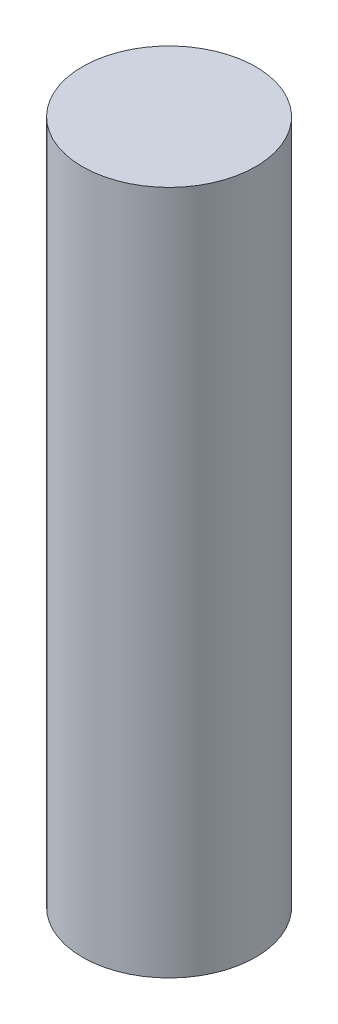
ISO-10303-21;
HEADER;
FILE_DESCRIPTION(('STEP AP214'),'2;1');
FILE_NAME('part.step','',(''),(''),'','','');
FILE_SCHEMA(('AUTOMOTIVE_DESIGN { 1 0 10303 214 1 1 1 1 }'));
ENDSEC;
DATA;
#1=APPLICATION_CONTEXT('core data for automotive mechanical design processes');
#2=APPLICATION_PROTOCOL_DEFINITION('international standard','automotive_design',2000,#1);
#3=PRODUCT_CONTEXT('',#1,'mechanical');
#4=PRODUCT('Part','Part','',(#3));
#5=PRODUCT_RELATED_PRODUCT_CATEGORY('part','',(#4));
#6=PRODUCT_DEFINITION_FORMATION('','',#4);
#7=PRODUCT_DEFINITION_CONTEXT('part definition',#1,'design');
#8=PRODUCT_DEFINITION('design','',#6,#7);
#9=PRODUCT_DEFINITION_SHAPE('','',#8);
#10=(LENGTH_UNIT() NAMED_UNIT(*) SI_UNIT(.MILLI.,.METRE.));
#11=(NAMED_UNIT(*) PLANE_ANGLE_UNIT() SI_UNIT($,.RADIAN.));
#12=(NAMED_UNIT(*) SI_UNIT($,.STERADIAN.) SOLID_ANGLE_UNIT());
#13=UNCERTAINTY_MEASURE_WITH_UNIT(LENGTH_MEASURE(1.E-05),#10,'distance_accuracy_value','');
#14=(GEOMETRIC_REPRESENTATION_CONTEXT(3) GLOBAL_UNCERTAINTY_ASSIGNED_CONTEXT((#13)) GLOBAL_UNIT_ASSIGNED_CONTEXT((#10,
#11,#12)) REPRESENTATION_CONTEXT('',''));
#15=CARTESIAN_POINT('',(0.,0.,0.));
#16=DIRECTION('',(0.,0.,1.));
#17=DIRECTION('',(1.,0.,0.));
#18=AXIS2_PLACEMENT_3D('',#15,#16,#17);
#19=CARTESIAN_POINT('',(0.,71.12,0.));
#20=DIRECTION('',(0.,-1.,0.));
#21=DIRECTION('',(0.,0.,-1.));
#22=AXIS2_PLACEMENT_3D('',#19,#20,#21);
#23=CYLINDRICAL_SURFACE('',#22,9.);
#24=CARTESIAN_POINT('',(0.,71.12,0.));
#25=DIRECTION('',(0.,1.,0.));
#26=DIRECTION('',(0.,0.,1.));
#27=AXIS2_PLACEMENT_3D('',#24,#25,#26);
#28=CIRCLE('',#27,9.);
#29=CARTESIAN_POINT('',(0.,71.12,9.));
#30=VERTEX_POINT('',#29);
#31=EDGE_CURVE('E10',#30,#30,#28,.T.);
#32=ORIENTED_EDGE('',*,*,#31,.F.);
#33=EDGE_LOOP('',(#32));
#34=FACE_BOUND('',#33,.T.);
#35=CARTESIAN_POINT('',(0.,0.,0.));
#36=DIRECTION('',(0.,1.,0.));
#37=DIRECTION('',(0.,0.,1.));
#38=AXIS2_PLACEMENT_3D('',#35,#36,#37);
#39=CIRCLE('',#38,9.);
#40=CARTESIAN_POINT('',(0.,0.,9.));
#41=VERTEX_POINT('',#40);
#42=EDGE_CURVE('E46',#41,#41,#39,.T.);
#43=ORIENTED_EDGE('',*,*,#42,.T.);
#44=EDGE_LOOP('',(#43));
#45=FACE_BOUND('',#44,.T.);
#46=ADVANCED_FACE('F43',(#34,#45),#23,.T.);
#47=CARTESIAN_POINT('',(0.,71.12,0.));
#48=DIRECTION('',(0.,1.,0.));
#49=DIRECTION('',(0.,0.,1.));
#50=AXIS2_PLACEMENT_3D('',#47,#48,#49);
#51=PLANE('',#50);
#52=ORIENTED_EDGE('',*,*,#31,.T.);
#53=EDGE_LOOP('',(#52));
#54=FACE_BOUND('',#53,.T.);
#55=ADVANCED_FACE('F60',(#54),#51,.T.);
#56=CARTESIAN_POINT('',(0.,0.,0.));
#57=DIRECTION('',(0.,1.,0.));
#58=DIRECTION('',(0.,0.,1.));
#59=AXIS2_PLACEMENT_3D('',#56,#57,#58);
#60=PLANE('',#59);
#61=ORIENTED_EDGE('',*,*,#42,.F.);
#62=EDGE_LOOP('',(#61));
#63=FACE_BOUND('',#62,.T.);
#64=ADVANCED_FACE('F58',(#63),#60,.F.);
#65=CLOSED_SHELL('',(#46,#55,#64));
#66=MANIFOLD_SOLID_BREP('B2',#65);
#67=ADVANCED_BREP_SHAPE_REPRESENTATION('',(#18,#66),#14);
#68=SHAPE_DEFINITION_REPRESENTATION(#9,#67);
ENDSEC;
END-ISO-10303-21;
